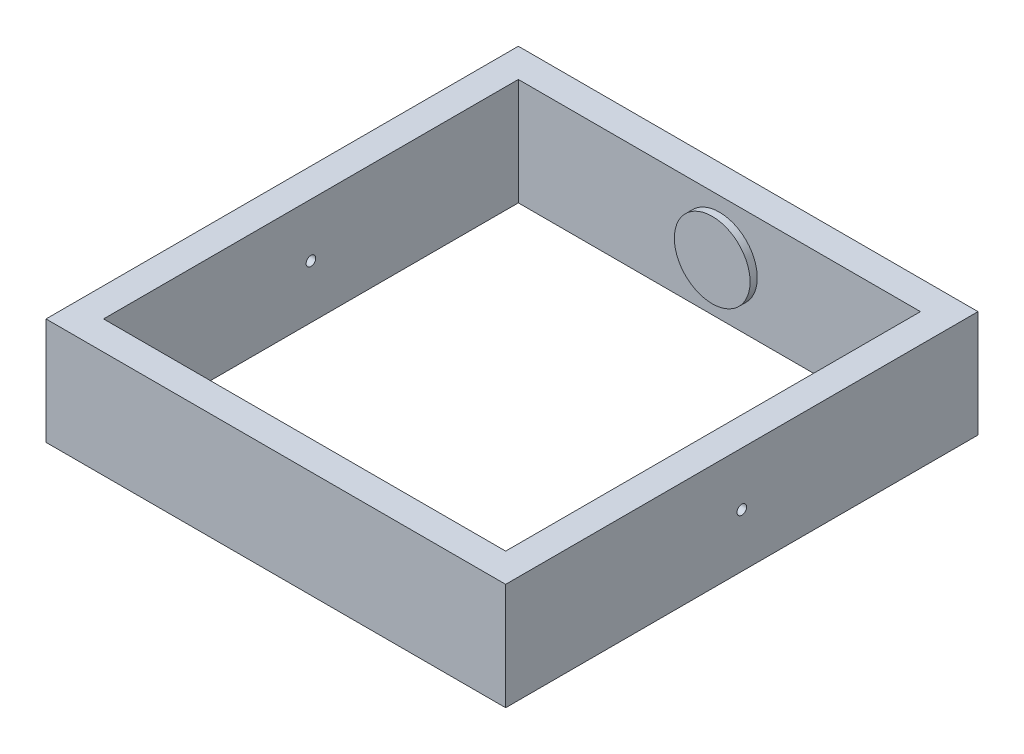
ISO-10303-21;
HEADER;
FILE_DESCRIPTION(('STEP AP214'),'2;1');
FILE_NAME('part.step','',(''),(''),'','','');
FILE_SCHEMA(('AUTOMOTIVE_DESIGN { 1 0 10303 214 1 1 1 1 }'));
ENDSEC;
DATA;
#1=APPLICATION_CONTEXT('core data for automotive mechanical design processes');
#2=APPLICATION_PROTOCOL_DEFINITION('international standard','automotive_design',2000,#1);
#3=PRODUCT_CONTEXT('',#1,'mechanical');
#4=PRODUCT('Part','Part','',(#3));
#5=PRODUCT_RELATED_PRODUCT_CATEGORY('part','',(#4));
#6=PRODUCT_DEFINITION_FORMATION('','',#4);
#7=PRODUCT_DEFINITION_CONTEXT('part definition',#1,'design');
#8=PRODUCT_DEFINITION('design','',#6,#7);
#9=PRODUCT_DEFINITION_SHAPE('','',#8);
#10=(LENGTH_UNIT() NAMED_UNIT(*) SI_UNIT(.MILLI.,.METRE.));
#11=(NAMED_UNIT(*) PLANE_ANGLE_UNIT() SI_UNIT($,.RADIAN.));
#12=(NAMED_UNIT(*) SI_UNIT($,.STERADIAN.) SOLID_ANGLE_UNIT());
#13=UNCERTAINTY_MEASURE_WITH_UNIT(LENGTH_MEASURE(1.E-05),#10,'distance_accuracy_value','');
#14=(GEOMETRIC_REPRESENTATION_CONTEXT(3) GLOBAL_UNCERTAINTY_ASSIGNED_CONTEXT((#13)) GLOBAL_UNIT_ASSIGNED_CONTEXT((#10,
#11,#12)) REPRESENTATION_CONTEXT('',''));
#15=CARTESIAN_POINT('',(0.,0.,0.));
#16=DIRECTION('',(0.,0.,1.));
#17=DIRECTION('',(1.,0.,0.));
#18=AXIS2_PLACEMENT_3D('',#15,#16,#17);
#19=CARTESIAN_POINT('',(144.052695888163,-17.9298462010281,-21.1680935138688));
#20=DIRECTION('',(-1.,0.,0.));
#21=DIRECTION('',(0.,0.,1.));
#22=AXIS2_PLACEMENT_3D('',#19,#20,#21);
#23=CYLINDRICAL_SURFACE('',#22,1.);
#24=CARTESIAN_POINT('',(-46.8517753370303,-17.9298462010281,-21.1680935138688));
#25=DIRECTION('',(-1.,0.,0.));
#26=DIRECTION('',(0.,0.,1.));
#27=AXIS2_PLACEMENT_3D('',#24,#25,#26);
#28=CIRCLE('',#27,1.);
#29=CARTESIAN_POINT('',(-46.8517753370303,-17.9298462010281,-20.1680935138688));
#30=VERTEX_POINT('',#29);
#31=EDGE_CURVE('E140',#30,#30,#28,.T.);
#32=ORIENTED_EDGE('',*,*,#31,.F.);
#33=EDGE_LOOP('',(#32));
#34=FACE_BOUND('',#33,.T.);
#35=CARTESIAN_POINT('',(-52.8517753370303,-17.9298462010281,-21.1680935138688));
#36=DIRECTION('',(1.,0.,0.));
#37=DIRECTION('',(0.,0.,-1.));
#38=AXIS2_PLACEMENT_3D('',#35,#36,#37);
#39=CIRCLE('',#38,1.);
#40=CARTESIAN_POINT('',(-52.8517753370303,-17.9298462010281,-22.1680935138688));
#41=VERTEX_POINT('',#40);
#42=EDGE_CURVE('E144',#41,#41,#39,.T.);
#43=ORIENTED_EDGE('',*,*,#42,.F.);
#44=EDGE_LOOP('',(#43));
#45=FACE_BOUND('',#44,.T.);
#46=ADVANCED_FACE('F45',(#34,#45),#23,.F.);
#47=CARTESIAN_POINT('',(-52.8517753370303,0.,0.));
#48=DIRECTION('',(-1.,0.,0.));
#49=DIRECTION('',(0.,0.,1.));
#50=AXIS2_PLACEMENT_3D('',#47,#48,#49);
#51=PLANE('',#50);
#52=DIRECTION('',(0.,1.,0.));
#53=VECTOR('',#52,1.);
#54=CARTESIAN_POINT('',(-52.8517753370303,-29.0798462010281,-70.4322935138688));
#55=LINE('',#54,#53);
#56=CARTESIAN_POINT('',(-52.8517753370303,-29.0798462010281,-70.4322935138688));
#57=VERTEX_POINT('',#56);
#58=CARTESIAN_POINT('',(-52.8517753370303,-6.7798462010281,-70.4322935138688));
#59=VERTEX_POINT('',#58);
#60=EDGE_CURVE('E160',#57,#59,#55,.T.);
#61=ORIENTED_EDGE('',*,*,#60,.F.);
#62=DIRECTION('',(0.,0.,-1.));
#63=VECTOR('',#62,1.);
#64=CARTESIAN_POINT('',(-52.8517753370303,-29.0798462010281,28.0961064861312));
#65=LINE('',#64,#63);
#66=CARTESIAN_POINT('',(-52.8517753370303,-29.0798462010281,28.0961064861312));
#67=VERTEX_POINT('',#66);
#68=EDGE_CURVE('E145',#67,#57,#65,.T.);
#69=ORIENTED_EDGE('',*,*,#68,.F.);
#70=DIRECTION('',(0.,-1.,0.));
#71=VECTOR('',#70,1.);
#72=CARTESIAN_POINT('',(-52.8517753370303,-29.0798462010281,28.0961064861312));
#73=LINE('',#72,#71);
#74=CARTESIAN_POINT('',(-52.8517753370303,-6.7798462010281,28.0961064861312));
#75=VERTEX_POINT('',#74);
#76=EDGE_CURVE('E150',#75,#67,#73,.T.);
#77=ORIENTED_EDGE('',*,*,#76,.F.);
#78=DIRECTION('',(0.,0.,1.));
#79=VECTOR('',#78,1.);
#80=CARTESIAN_POINT('',(-52.8517753370303,-6.7798462010281,28.0961064861312));
#81=LINE('',#80,#79);
#82=EDGE_CURVE('E155',#59,#75,#81,.T.);
#83=ORIENTED_EDGE('',*,*,#82,.F.);
#84=EDGE_LOOP('',(#61,#69,#77,#83));
#85=FACE_BOUND('',#84,.T.);
#86=ORIENTED_EDGE('',*,*,#42,.T.);
#87=EDGE_LOOP('',(#86));
#88=FACE_BOUND('',#87,.T.);
#89=ADVANCED_FACE('F217',(#85,#88),#51,.T.);
#90=CARTESIAN_POINT('',(144.052695888163,-29.0798462010281,-70.4322935138688));
#91=DIRECTION('',(0.,0.,1.));
#92=DIRECTION('',(1.,0.,0.));
#93=AXIS2_PLACEMENT_3D('',#90,#91,#92);
#94=PLANE('',#93);
#95=DIRECTION('',(-1.,0.,0.));
#96=VECTOR('',#95,1.);
#97=CARTESIAN_POINT('',(144.052695888163,-6.7798462010281,-70.4322935138688));
#98=LINE('',#97,#96);
#99=CARTESIAN_POINT('',(43.0322246629697,-6.7798462010281,-70.4322935138688));
#100=VERTEX_POINT('',#99);
#101=EDGE_CURVE('E159',#100,#59,#98,.T.);
#102=ORIENTED_EDGE('',*,*,#101,.F.);
#103=DIRECTION('',(0.,-1.,0.));
#104=VECTOR('',#103,1.);
#105=CARTESIAN_POINT('',(43.0322246629697,-29.0798462010281,-70.4322935138688));
#106=LINE('',#105,#104);
#107=CARTESIAN_POINT('',(43.0322246629697,-29.0798462010281,-70.4322935138688));
#108=VERTEX_POINT('',#107);
#109=EDGE_CURVE('E167',#100,#108,#106,.T.);
#110=ORIENTED_EDGE('',*,*,#109,.T.);
#111=DIRECTION('',(-1.,0.,0.));
#112=VECTOR('',#111,1.);
#113=CARTESIAN_POINT('',(144.052695888163,-29.0798462010281,-70.4322935138688));
#114=LINE('',#113,#112);
#115=EDGE_CURVE('E164',#108,#57,#114,.T.);
#116=ORIENTED_EDGE('',*,*,#115,.T.);
#117=ORIENTED_EDGE('',*,*,#60,.T.);
#118=EDGE_LOOP('',(#102,#110,#116,#117));
#119=FACE_BOUND('',#118,.T.);
#120=ADVANCED_FACE('F226',(#119),#94,.F.);
#121=CARTESIAN_POINT('',(144.052695888163,-6.7798462010281,28.0961064861312));
#122=DIRECTION('',(0.,-1.,0.));
#123=DIRECTION('',(0.,0.,-1.));
#124=AXIS2_PLACEMENT_3D('',#121,#122,#123);
#125=PLANE('',#124);
#126=DIRECTION('',(1.,0.,0.));
#127=VECTOR('',#126,1.);
#128=CARTESIAN_POINT('',(-46.8517753370303,-6.7798462010281,22.0961064861313));
#129=LINE('',#128,#127);
#130=CARTESIAN_POINT('',(-46.8517753370303,-6.7798462010281,22.0961064861313));
#131=VERTEX_POINT('',#130);
#132=CARTESIAN_POINT('',(37.0322246629697,-6.7798462010281,22.0961064861313));
#133=VERTEX_POINT('',#132);
#134=EDGE_CURVE('E122',#131,#133,#129,.T.);
#135=ORIENTED_EDGE('',*,*,#134,.F.);
#136=DIRECTION('',(0.,0.,1.));
#137=VECTOR('',#136,1.);
#138=CARTESIAN_POINT('',(-46.8517753370303,-6.7798462010281,-64.4322935138688));
#139=LINE('',#138,#137);
#140=CARTESIAN_POINT('',(-46.8517753370303,-6.7798462010281,-64.4322935138688));
#141=VERTEX_POINT('',#140);
#142=EDGE_CURVE('E60',#141,#131,#139,.T.);
#143=ORIENTED_EDGE('',*,*,#142,.F.);
#144=DIRECTION('',(-1.,0.,0.));
#145=VECTOR('',#144,1.);
#146=CARTESIAN_POINT('',(37.0322246629697,-6.7798462010281,-64.4322935138688));
#147=LINE('',#146,#145);
#148=CARTESIAN_POINT('',(37.0322246629697,-6.7798462010281,-64.4322935138688));
#149=VERTEX_POINT('',#148);
#150=EDGE_CURVE('E129',#149,#141,#147,.T.);
#151=ORIENTED_EDGE('',*,*,#150,.F.);
#152=DIRECTION('',(0.,0.,-1.));
#153=VECTOR('',#152,1.);
#154=CARTESIAN_POINT('',(37.0322246629697,-6.7798462010281,22.0961064861313));
#155=LINE('',#154,#153);
#156=EDGE_CURVE('E113',#133,#149,#155,.T.);
#157=ORIENTED_EDGE('',*,*,#156,.F.);
#158=EDGE_LOOP('',(#135,#143,#151,#157));
#159=FACE_BOUND('',#158,.T.);
#160=DIRECTION('',(-1.,0.,0.));
#161=VECTOR('',#160,1.);
#162=CARTESIAN_POINT('',(144.052695888163,-6.7798462010281,28.0961064861312));
#163=LINE('',#162,#161);
#164=CARTESIAN_POINT('',(43.0322246629697,-6.7798462010281,28.0961064861312));
#165=VERTEX_POINT('',#164);
#166=EDGE_CURVE('E154',#165,#75,#163,.T.);
#167=ORIENTED_EDGE('',*,*,#166,.F.);
#168=DIRECTION('',(0.,0.,-1.));
#169=VECTOR('',#168,1.);
#170=CARTESIAN_POINT('',(43.0322246629697,-6.7798462010281,28.0961064861312));
#171=LINE('',#170,#169);
#172=EDGE_CURVE('E163',#165,#100,#171,.T.);
#173=ORIENTED_EDGE('',*,*,#172,.T.);
#174=ORIENTED_EDGE('',*,*,#101,.T.);
#175=ORIENTED_EDGE('',*,*,#82,.T.);
#176=EDGE_LOOP('',(#167,#173,#174,#175));
#177=FACE_BOUND('',#176,.T.);
#178=ADVANCED_FACE('F126',(#159,#177),#125,.F.);
#179=CARTESIAN_POINT('',(144.052695888163,-29.0798462010281,28.0961064861312));
#180=DIRECTION('',(0.,0.,-1.));
#181=DIRECTION('',(-1.,0.,0.));
#182=AXIS2_PLACEMENT_3D('',#179,#180,#181);
#183=PLANE('',#182);
#184=DIRECTION('',(-1.,0.,0.));
#185=VECTOR('',#184,1.);
#186=CARTESIAN_POINT('',(144.052695888163,-29.0798462010281,28.0961064861312));
#187=LINE('',#186,#185);
#188=CARTESIAN_POINT('',(43.0322246629697,-29.0798462010281,28.0961064861312));
#189=VERTEX_POINT('',#188);
#190=EDGE_CURVE('E149',#189,#67,#187,.T.);
#191=ORIENTED_EDGE('',*,*,#190,.F.);
#192=DIRECTION('',(0.,1.,0.));
#193=VECTOR('',#192,1.);
#194=CARTESIAN_POINT('',(43.0322246629697,-29.0798462010281,28.0961064861312));
#195=LINE('',#194,#193);
#196=EDGE_CURVE('E158',#189,#165,#195,.T.);
#197=ORIENTED_EDGE('',*,*,#196,.T.);
#198=ORIENTED_EDGE('',*,*,#166,.T.);
#199=ORIENTED_EDGE('',*,*,#76,.T.);
#200=EDGE_LOOP('',(#191,#197,#198,#199));
#201=FACE_BOUND('',#200,.T.);
#202=ADVANCED_FACE('F238',(#201),#183,.F.);
#203=CARTESIAN_POINT('',(144.052695888163,-29.0798462010281,28.0961064861312));
#204=DIRECTION('',(0.,1.,0.));
#205=DIRECTION('',(0.,0.,1.));
#206=AXIS2_PLACEMENT_3D('',#203,#204,#205);
#207=PLANE('',#206);
#208=DIRECTION('',(-1.,0.,0.));
#209=VECTOR('',#208,1.);
#210=CARTESIAN_POINT('',(144.052695888163,-29.0798462010281,-64.4322935138688));
#211=LINE('',#210,#209);
#212=CARTESIAN_POINT('',(37.0322246629697,-29.0798462010281,-64.4322935138688));
#213=VERTEX_POINT('',#212);
#214=CARTESIAN_POINT('',(-46.8517753370303,-29.0798462010281,-64.4322935138688));
#215=VERTEX_POINT('',#214);
#216=EDGE_CURVE('E188',#213,#215,#211,.T.);
#217=ORIENTED_EDGE('',*,*,#216,.T.);
#218=DIRECTION('',(0.,0.,1.));
#219=VECTOR('',#218,1.);
#220=CARTESIAN_POINT('',(-46.8517753370303,-29.0798462010281,28.0961064861312));
#221=LINE('',#220,#219);
#222=CARTESIAN_POINT('',(-46.8517753370303,-29.0798462010281,22.0961064861313));
#223=VERTEX_POINT('',#222);
#224=EDGE_CURVE('E141',#215,#223,#221,.T.);
#225=ORIENTED_EDGE('',*,*,#224,.T.);
#226=DIRECTION('',(1.,0.,0.));
#227=VECTOR('',#226,1.);
#228=CARTESIAN_POINT('',(144.052695888163,-29.0798462010281,22.0961064861313));
#229=LINE('',#228,#227);
#230=CARTESIAN_POINT('',(37.0322246629697,-29.0798462010281,22.0961064861313));
#231=VERTEX_POINT('',#230);
#232=EDGE_CURVE('E182',#223,#231,#229,.T.);
#233=ORIENTED_EDGE('',*,*,#232,.T.);
#234=DIRECTION('',(0.,0.,-1.));
#235=VECTOR('',#234,1.);
#236=CARTESIAN_POINT('',(37.0322246629697,-29.0798462010281,28.0961064861312));
#237=LINE('',#236,#235);
#238=EDGE_CURVE('E116',#231,#213,#237,.T.);
#239=ORIENTED_EDGE('',*,*,#238,.T.);
#240=EDGE_LOOP('',(#217,#225,#233,#239));
#241=FACE_BOUND('',#240,.T.);
#242=ORIENTED_EDGE('',*,*,#115,.F.);
#243=DIRECTION('',(0.,0.,1.));
#244=VECTOR('',#243,1.);
#245=CARTESIAN_POINT('',(43.0322246629697,-29.0798462010281,28.0961064861312));
#246=LINE('',#245,#244);
#247=EDGE_CURVE('E153',#108,#189,#246,.T.);
#248=ORIENTED_EDGE('',*,*,#247,.T.);
#249=ORIENTED_EDGE('',*,*,#190,.T.);
#250=ORIENTED_EDGE('',*,*,#68,.T.);
#251=EDGE_LOOP('',(#242,#248,#249,#250));
#252=FACE_BOUND('',#251,.T.);
#253=ADVANCED_FACE('F201',(#241,#252),#207,.F.);
#254=CARTESIAN_POINT('',(37.0322246629697,-17.9298462010281,-21.1680935138688));
#255=DIRECTION('',(1.,0.,0.));
#256=DIRECTION('',(0.,0.,-1.));
#257=AXIS2_PLACEMENT_3D('',#254,#255,#256);
#258=CIRCLE('',#257,1.);
#259=CARTESIAN_POINT('',(37.0322246629697,-17.9298462010281,-22.1680935138688));
#260=VERTEX_POINT('',#259);
#261=EDGE_CURVE('E136',#260,#260,#258,.T.);
#262=ORIENTED_EDGE('',*,*,#261,.F.);
#263=EDGE_LOOP('',(#262));
#264=FACE_BOUND('',#263,.T.);
#265=CARTESIAN_POINT('',(43.0322246629697,-17.9298462010281,-21.1680935138688));
#266=DIRECTION('',(-1.,0.,0.));
#267=DIRECTION('',(0.,0.,1.));
#268=AXIS2_PLACEMENT_3D('',#265,#266,#267);
#269=CIRCLE('',#268,1.);
#270=CARTESIAN_POINT('',(43.0322246629697,-17.9298462010281,-20.1680935138688));
#271=VERTEX_POINT('',#270);
#272=EDGE_CURVE('E148',#271,#271,#269,.T.);
#273=ORIENTED_EDGE('',*,*,#272,.F.);
#274=EDGE_LOOP('',(#273));
#275=FACE_BOUND('',#274,.T.);
#276=ADVANCED_FACE('F219',(#264,#275),#23,.F.);
#277=CARTESIAN_POINT('',(43.0322246629697,-18.3501962010293,-21.1680935138687));
#278=DIRECTION('',(-1.,0.,0.));
#279=DIRECTION('',(0.,0.,1.));
#280=AXIS2_PLACEMENT_3D('',#277,#278,#279);
#281=PLANE('',#280);
#282=ORIENTED_EDGE('',*,*,#272,.T.);
#283=EDGE_LOOP('',(#282));
#284=FACE_BOUND('',#283,.T.);
#285=ORIENTED_EDGE('',*,*,#172,.F.);
#286=ORIENTED_EDGE('',*,*,#196,.F.);
#287=ORIENTED_EDGE('',*,*,#247,.F.);
#288=ORIENTED_EDGE('',*,*,#109,.F.);
#289=EDGE_LOOP('',(#285,#286,#287,#288));
#290=FACE_BOUND('',#289,.T.);
#291=ADVANCED_FACE('F47',(#284,#290),#281,.F.);
#292=CARTESIAN_POINT('',(37.0322246629697,-41.6242570881156,-64.4322935138688));
#293=DIRECTION('',(0.,0.,-1.));
#294=DIRECTION('',(-1.,0.,0.));
#295=AXIS2_PLACEMENT_3D('',#292,#293,#294);
#296=PLANE('',#295);
#297=CARTESIAN_POINT('',(-4.90977533703027,-17.6798462010281,-64.4322935138688));
#298=DIRECTION('',(0.,0.,-1.));
#299=DIRECTION('',(-1.,0.,0.));
#300=AXIS2_PLACEMENT_3D('',#297,#298,#299);
#301=CIRCLE('',#300,7.9);
#302=CARTESIAN_POINT('',(-12.8097753370303,-17.6798462010281,-64.4322935138688));
#303=VERTEX_POINT('',#302);
#304=EDGE_CURVE('E53',#303,#303,#301,.F.);
#305=ORIENTED_EDGE('',*,*,#304,.F.);
#306=EDGE_LOOP('',(#305));
#307=FACE_BOUND('',#306,.T.);
#308=DIRECTION('',(0.,1.,0.));
#309=VECTOR('',#308,1.);
#310=CARTESIAN_POINT('',(37.0322246629697,-41.6242570881156,-64.4322935138688));
#311=LINE('',#310,#309);
#312=EDGE_CURVE('E118',#213,#149,#311,.T.);
#313=ORIENTED_EDGE('',*,*,#312,.T.);
#314=ORIENTED_EDGE('',*,*,#150,.T.);
#315=DIRECTION('',(0.,1.,0.));
#316=VECTOR('',#315,1.);
#317=CARTESIAN_POINT('',(-46.8517753370303,-41.6242570881156,-64.4322935138688));
#318=LINE('',#317,#316);
#319=EDGE_CURVE('E134',#215,#141,#318,.T.);
#320=ORIENTED_EDGE('',*,*,#319,.F.);
#321=ORIENTED_EDGE('',*,*,#216,.F.);
#322=EDGE_LOOP('',(#313,#314,#320,#321));
#323=FACE_BOUND('',#322,.T.);
#324=ADVANCED_FACE('F195',(#307,#323),#296,.F.);
#325=CARTESIAN_POINT('',(-46.8517753370303,-41.6242570881156,22.0961064861313));
#326=DIRECTION('',(0.,0.,1.));
#327=DIRECTION('',(1.,0.,0.));
#328=AXIS2_PLACEMENT_3D('',#325,#326,#327);
#329=PLANE('',#328);
#330=CARTESIAN_POINT('',(-4.90977533703027,-17.6798462010281,22.0961064861313));
#331=DIRECTION('',(0.,0.,1.));
#332=DIRECTION('',(1.,0.,0.));
#333=AXIS2_PLACEMENT_3D('',#330,#331,#332);
#334=CIRCLE('',#333,7.9);
#335=CARTESIAN_POINT('',(2.99022466296973,-17.6798462010281,22.0961064861313));
#336=VERTEX_POINT('',#335);
#337=EDGE_CURVE('E11',#336,#336,#334,.F.);
#338=ORIENTED_EDGE('',*,*,#337,.F.);
#339=EDGE_LOOP('',(#338));
#340=FACE_BOUND('',#339,.T.);
#341=DIRECTION('',(0.,1.,0.));
#342=VECTOR('',#341,1.);
#343=CARTESIAN_POINT('',(-46.8517753370303,-41.6242570881156,22.0961064861313));
#344=LINE('',#343,#342);
#345=EDGE_CURVE('E119',#223,#131,#344,.T.);
#346=ORIENTED_EDGE('',*,*,#345,.T.);
#347=ORIENTED_EDGE('',*,*,#134,.T.);
#348=DIRECTION('',(0.,1.,0.));
#349=VECTOR('',#348,1.);
#350=CARTESIAN_POINT('',(37.0322246629697,-41.6242570881156,22.0961064861313));
#351=LINE('',#350,#349);
#352=EDGE_CURVE('E68',#231,#133,#351,.T.);
#353=ORIENTED_EDGE('',*,*,#352,.F.);
#354=ORIENTED_EDGE('',*,*,#232,.F.);
#355=EDGE_LOOP('',(#346,#347,#353,#354));
#356=FACE_BOUND('',#355,.T.);
#357=ADVANCED_FACE('F123',(#340,#356),#329,.F.);
#358=CARTESIAN_POINT('',(-46.8517753370303,-41.6242570881156,-64.4322935138688));
#359=DIRECTION('',(-1.,0.,0.));
#360=DIRECTION('',(0.,0.,1.));
#361=AXIS2_PLACEMENT_3D('',#358,#359,#360);
#362=PLANE('',#361);
#363=ORIENTED_EDGE('',*,*,#31,.T.);
#364=EDGE_LOOP('',(#363));
#365=FACE_BOUND('',#364,.T.);
#366=ORIENTED_EDGE('',*,*,#319,.T.);
#367=ORIENTED_EDGE('',*,*,#142,.T.);
#368=ORIENTED_EDGE('',*,*,#345,.F.);
#369=ORIENTED_EDGE('',*,*,#224,.F.);
#370=EDGE_LOOP('',(#366,#367,#368,#369));
#371=FACE_BOUND('',#370,.T.);
#372=ADVANCED_FACE('F203',(#365,#371),#362,.F.);
#373=CARTESIAN_POINT('',(37.0322246629697,-41.6242570881156,22.0961064861313));
#374=DIRECTION('',(1.,0.,0.));
#375=DIRECTION('',(0.,0.,-1.));
#376=AXIS2_PLACEMENT_3D('',#373,#374,#375);
#377=PLANE('',#376);
#378=ORIENTED_EDGE('',*,*,#261,.T.);
#379=EDGE_LOOP('',(#378));
#380=FACE_BOUND('',#379,.T.);
#381=ORIENTED_EDGE('',*,*,#352,.T.);
#382=ORIENTED_EDGE('',*,*,#156,.T.);
#383=ORIENTED_EDGE('',*,*,#312,.F.);
#384=ORIENTED_EDGE('',*,*,#238,.F.);
#385=EDGE_LOOP('',(#381,#382,#383,#384));
#386=FACE_BOUND('',#385,.T.);
#387=ADVANCED_FACE('F110',(#380,#386),#377,.F.);
#388=CARTESIAN_POINT('',(-4.90977533703027,-17.6798462010281,-62.9322935138688));
#389=DIRECTION('',(0.,0.,-1.));
#390=DIRECTION('',(-1.,0.,0.));
#391=AXIS2_PLACEMENT_3D('',#388,#389,#390);
#392=CYLINDRICAL_SURFACE('',#391,7.9);
#393=CARTESIAN_POINT('',(-4.90977533703027,-17.6798462010281,-62.9322935138688));
#394=DIRECTION('',(0.,0.,1.));
#395=DIRECTION('',(1.,0.,0.));
#396=AXIS2_PLACEMENT_3D('',#393,#394,#395);
#397=CIRCLE('',#396,7.9);
#398=CARTESIAN_POINT('',(2.99022466296973,-17.6798462010281,-62.9322935138688));
#399=VERTEX_POINT('',#398);
#400=EDGE_CURVE('E366',#399,#399,#397,.T.);
#401=ORIENTED_EDGE('',*,*,#400,.F.);
#402=EDGE_LOOP('',(#401));
#403=FACE_BOUND('',#402,.T.);
#404=ORIENTED_EDGE('',*,*,#304,.T.);
#405=EDGE_LOOP('',(#404));
#406=FACE_BOUND('',#405,.T.);
#407=ADVANCED_FACE('F193',(#403,#406),#392,.T.);
#408=CARTESIAN_POINT('',(-4.90977533703027,-17.6798462010281,-62.9322935138688));
#409=DIRECTION('',(0.,0.,1.));
#410=DIRECTION('',(1.,0.,0.));
#411=AXIS2_PLACEMENT_3D('',#408,#409,#410);
#412=PLANE('',#411);
#413=ORIENTED_EDGE('',*,*,#400,.T.);
#414=EDGE_LOOP('',(#413));
#415=FACE_BOUND('',#414,.T.);
#416=ADVANCED_FACE('F279',(#415),#412,.T.);
#417=CARTESIAN_POINT('',(-4.90977533703027,-17.6798462010281,20.5961064861312));
#418=DIRECTION('',(0.,0.,1.));
#419=DIRECTION('',(-1.,0.,0.));
#420=AXIS2_PLACEMENT_3D('',#417,#418,#419);
#421=CYLINDRICAL_SURFACE('',#420,7.9);
#422=CARTESIAN_POINT('',(-4.90977533703027,-17.6798462010281,20.5961064861312));
#423=DIRECTION('',(0.,0.,1.));
#424=DIRECTION('',(1.,0.,0.));
#425=AXIS2_PLACEMENT_3D('',#422,#423,#424);
#426=CIRCLE('',#425,7.9);
#427=CARTESIAN_POINT('',(2.99022466296973,-17.6798462010281,20.5961064861312));
#428=VERTEX_POINT('',#427);
#429=EDGE_CURVE('E365',#428,#428,#426,.T.);
#430=ORIENTED_EDGE('',*,*,#429,.T.);
#431=EDGE_LOOP('',(#430));
#432=FACE_BOUND('',#431,.T.);
#433=ORIENTED_EDGE('',*,*,#337,.T.);
#434=EDGE_LOOP('',(#433));
#435=FACE_BOUND('',#434,.T.);
#436=ADVANCED_FACE('F288',(#432,#435),#421,.T.);
#437=CARTESIAN_POINT('',(-4.90977533703027,-17.6798462010281,20.5961064861312));
#438=DIRECTION('',(0.,0.,-1.));
#439=DIRECTION('',(1.,0.,0.));
#440=AXIS2_PLACEMENT_3D('',#437,#438,#439);
#441=PLANE('',#440);
#442=ORIENTED_EDGE('',*,*,#429,.F.);
#443=EDGE_LOOP('',(#442));
#444=FACE_BOUND('',#443,.T.);
#445=ADVANCED_FACE('F298',(#444),#441,.T.);
#446=CLOSED_SHELL('',(#46,#89,#120,#178,#202,#253,#276,#291,#324,#357,#372,#387,#407,#416,#436,#445));
#447=MANIFOLD_SOLID_BREP('B2',#446);
#448=ADVANCED_BREP_SHAPE_REPRESENTATION('',(#18,#447),#14);
#449=SHAPE_DEFINITION_REPRESENTATION(#9,#448);
ENDSEC;
END-ISO-10303-21;
